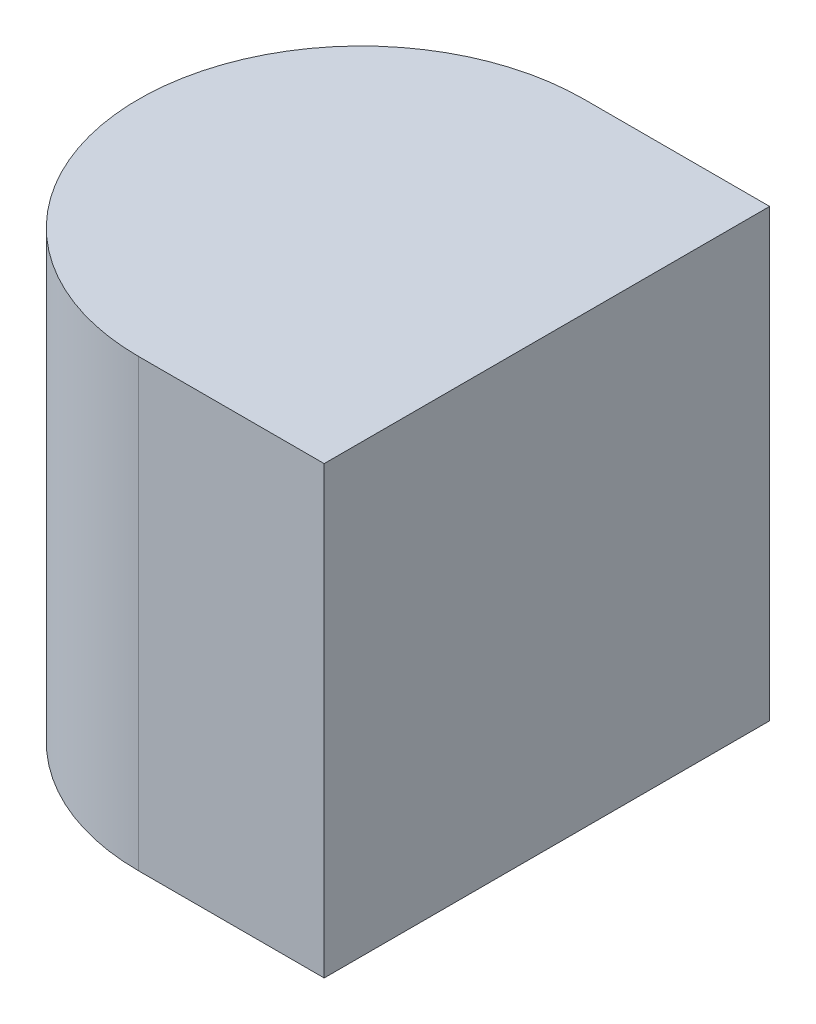
ISO-10303-21;
HEADER;
FILE_DESCRIPTION(('STEP AP214'),'2;1');
FILE_NAME('part.step','',(''),(''),'','','');
FILE_SCHEMA(('AUTOMOTIVE_DESIGN { 1 0 10303 214 1 1 1 1 }'));
ENDSEC;
DATA;
#1=APPLICATION_CONTEXT('core data for automotive mechanical design processes');
#2=APPLICATION_PROTOCOL_DEFINITION('international standard','automotive_design',2000,#1);
#3=PRODUCT_CONTEXT('',#1,'mechanical');
#4=PRODUCT('Part','Part','',(#3));
#5=PRODUCT_RELATED_PRODUCT_CATEGORY('part','',(#4));
#6=PRODUCT_DEFINITION_FORMATION('','',#4);
#7=PRODUCT_DEFINITION_CONTEXT('part definition',#1,'design');
#8=PRODUCT_DEFINITION('design','',#6,#7);
#9=PRODUCT_DEFINITION_SHAPE('','',#8);
#10=(LENGTH_UNIT() NAMED_UNIT(*) SI_UNIT(.MILLI.,.METRE.));
#11=(NAMED_UNIT(*) PLANE_ANGLE_UNIT() SI_UNIT($,.RADIAN.));
#12=(NAMED_UNIT(*) SI_UNIT($,.STERADIAN.) SOLID_ANGLE_UNIT());
#13=UNCERTAINTY_MEASURE_WITH_UNIT(LENGTH_MEASURE(1.E-05),#10,'distance_accuracy_value','');
#14=(GEOMETRIC_REPRESENTATION_CONTEXT(3) GLOBAL_UNCERTAINTY_ASSIGNED_CONTEXT((#13)) GLOBAL_UNIT_ASSIGNED_CONTEXT((#10,
#11,#12)) REPRESENTATION_CONTEXT('',''));
#15=CARTESIAN_POINT('',(0.,0.,0.));
#16=DIRECTION('',(0.,0.,1.));
#17=DIRECTION('',(1.,0.,0.));
#18=AXIS2_PLACEMENT_3D('',#15,#16,#17);
#19=CARTESIAN_POINT('',(-118.270219320132,-255.599072168842,-908.24864798632));
#20=DIRECTION('',(1.,0.,0.));
#21=DIRECTION('',(0.,1.,0.));
#22=AXIS2_PLACEMENT_3D('',#19,#20,#21);
#23=PLANE('',#22);
#24=DIRECTION('',(0.,0.,-1.));
#25=VECTOR('',#24,1.);
#26=CARTESIAN_POINT('',(-118.270219320132,-255.599072168842,-907.486147986319));
#27=LINE('',#26,#25);
#28=CARTESIAN_POINT('',(-118.270219320132,-255.599072168842,-908.39864798632));
#29=VERTEX_POINT('',#28);
#30=CARTESIAN_POINT('',(-118.270219320132,-255.599072168842,-908.24864798632));
#31=VERTEX_POINT('',#30);
#32=EDGE_CURVE('E53',#29,#31,#27,.F.);
#33=ORIENTED_EDGE('',*,*,#32,.T.);
#34=DIRECTION('',(0.,-1.,0.));
#35=VECTOR('',#34,1.);
#36=CARTESIAN_POINT('',(-118.270219320132,-255.599072168842,-908.24864798632));
#37=LINE('',#36,#35);
#38=CARTESIAN_POINT('',(-118.270219320132,-255.749072168844,-908.24864798632));
#39=VERTEX_POINT('',#38);
#40=EDGE_CURVE('E73',#39,#31,#37,.F.);
#41=ORIENTED_EDGE('',*,*,#40,.F.);
#42=DIRECTION('',(0.,0.,-1.));
#43=VECTOR('',#42,1.);
#44=CARTESIAN_POINT('',(-118.270219320132,-255.749072168844,-908.222757346923));
#45=LINE('',#44,#43);
#46=CARTESIAN_POINT('',(-118.270219320132,-255.749072168844,-908.39864798632));
#47=VERTEX_POINT('',#46);
#48=EDGE_CURVE('E62',#47,#39,#45,.F.);
#49=ORIENTED_EDGE('',*,*,#48,.F.);
#50=DIRECTION('',(0.,1.,0.));
#51=VECTOR('',#50,1.);
#52=CARTESIAN_POINT('',(-118.270219320132,-255.599072168842,-908.39864798632));
#53=LINE('',#52,#51);
#54=EDGE_CURVE('E93',#29,#47,#53,.F.);
#55=ORIENTED_EDGE('',*,*,#54,.F.);
#56=EDGE_LOOP('',(#33,#41,#49,#55));
#57=FACE_BOUND('',#56,.T.);
#58=ADVANCED_FACE('F17',(#57),#23,.T.);
#59=CARTESIAN_POINT('',(-118.321373910134,-255.749072168844,-908.222757346923));
#60=DIRECTION('',(0.,-1.,0.));
#61=DIRECTION('',(0.,0.,-1.));
#62=AXIS2_PLACEMENT_3D('',#59,#60,#61);
#63=PLANE('',#62);
#64=CARTESIAN_POINT('',(-118.332719320132,-255.749072168844,-908.32364798632));
#65=DIRECTION('',(0.,-1.,0.));
#66=DIRECTION('',(0.,0.,-1.));
#67=AXIS2_PLACEMENT_3D('',#64,#65,#66);
#68=CIRCLE('',#67,0.075);
#69=CARTESIAN_POINT('',(-118.332719320132,-255.749072168844,-908.39864798632));
#70=VERTEX_POINT('',#69);
#71=CARTESIAN_POINT('',(-118.332719320132,-255.749072168844,-908.24864798632));
#72=VERTEX_POINT('',#71);
#73=EDGE_CURVE('E20',#70,#72,#68,.F.);
#74=ORIENTED_EDGE('',*,*,#73,.F.);
#75=DIRECTION('',(1.,0.,0.));
#76=VECTOR('',#75,1.);
#77=CARTESIAN_POINT('',(-118.270219320132,-255.749072168844,-908.39864798632));
#78=LINE('',#77,#76);
#79=EDGE_CURVE('E68',#47,#70,#78,.F.);
#80=ORIENTED_EDGE('',*,*,#79,.F.);
#81=ORIENTED_EDGE('',*,*,#48,.T.);
#82=DIRECTION('',(1.,0.,0.));
#83=VECTOR('',#82,1.);
#84=CARTESIAN_POINT('',(-118.332719320132,-255.749072168844,-908.24864798632));
#85=LINE('',#84,#83);
#86=EDGE_CURVE('E66',#72,#39,#85,.T.);
#87=ORIENTED_EDGE('',*,*,#86,.F.);
#88=EDGE_LOOP('',(#74,#80,#81,#87));
#89=FACE_BOUND('',#88,.T.);
#90=ADVANCED_FACE('F64',(#89),#63,.T.);
#91=CARTESIAN_POINT('',(-118.332719320132,-255.599072168842,-908.24864798632));
#92=DIRECTION('',(0.,0.,1.));
#93=DIRECTION('',(0.,-1.,0.));
#94=AXIS2_PLACEMENT_3D('',#91,#92,#93);
#95=PLANE('',#94);
#96=DIRECTION('',(1.,0.,0.));
#97=VECTOR('',#96,1.);
#98=CARTESIAN_POINT('',(-114.682719320133,-255.599072168842,-908.24864798632));
#99=LINE('',#98,#97);
#100=CARTESIAN_POINT('',(-118.332719320132,-255.599072168842,-908.24864798632));
#101=VERTEX_POINT('',#100);
#102=EDGE_CURVE('E76',#31,#101,#99,.F.);
#103=ORIENTED_EDGE('',*,*,#102,.T.);
#104=DIRECTION('',(0.,-1.,0.));
#105=VECTOR('',#104,1.);
#106=CARTESIAN_POINT('',(-118.332719320132,-255.599072168842,-908.24864798632));
#107=LINE('',#106,#105);
#108=EDGE_CURVE('E80',#72,#101,#107,.F.);
#109=ORIENTED_EDGE('',*,*,#108,.F.);
#110=ORIENTED_EDGE('',*,*,#86,.T.);
#111=ORIENTED_EDGE('',*,*,#40,.T.);
#112=EDGE_LOOP('',(#103,#109,#110,#111));
#113=FACE_BOUND('',#112,.T.);
#114=ADVANCED_FACE('F78',(#113),#95,.T.);
#115=CARTESIAN_POINT('',(-114.682719320133,-255.599072168842,-907.486147986319));
#116=DIRECTION('',(0.,-1.,0.));
#117=DIRECTION('',(0.,0.,-1.));
#118=AXIS2_PLACEMENT_3D('',#115,#116,#117);
#119=PLANE('',#118);
#120=DIRECTION('',(1.,0.,0.));
#121=VECTOR('',#120,1.);
#122=CARTESIAN_POINT('',(-118.270219320132,-255.599072168842,-908.39864798632));
#123=LINE('',#122,#121);
#124=CARTESIAN_POINT('',(-118.332719320132,-255.599072168842,-908.39864798632));
#125=VERTEX_POINT('',#124);
#126=EDGE_CURVE('E36',#125,#29,#123,.T.);
#127=ORIENTED_EDGE('',*,*,#126,.F.);
#128=CARTESIAN_POINT('',(-118.332719320132,-255.599072168842,-908.32364798632));
#129=DIRECTION('',(0.,-1.,0.));
#130=DIRECTION('',(0.,0.,-1.));
#131=AXIS2_PLACEMENT_3D('',#128,#129,#130);
#132=CIRCLE('',#131,0.075);
#133=EDGE_CURVE('E27',#101,#125,#132,.T.);
#134=ORIENTED_EDGE('',*,*,#133,.F.);
#135=ORIENTED_EDGE('',*,*,#102,.F.);
#136=ORIENTED_EDGE('',*,*,#32,.F.);
#137=EDGE_LOOP('',(#127,#134,#135,#136));
#138=FACE_BOUND('',#137,.T.);
#139=ADVANCED_FACE('F120',(#138),#119,.F.);
#140=CARTESIAN_POINT('',(-118.270219320132,-255.599072168842,-908.39864798632));
#141=DIRECTION('',(0.,0.,-1.));
#142=DIRECTION('',(0.,1.,0.));
#143=AXIS2_PLACEMENT_3D('',#140,#141,#142);
#144=PLANE('',#143);
#145=ORIENTED_EDGE('',*,*,#126,.T.);
#146=ORIENTED_EDGE('',*,*,#54,.T.);
#147=ORIENTED_EDGE('',*,*,#79,.T.);
#148=DIRECTION('',(0.,1.,0.));
#149=VECTOR('',#148,1.);
#150=CARTESIAN_POINT('',(-118.332719320132,-255.599072168842,-908.39864798632));
#151=LINE('',#150,#149);
#152=EDGE_CURVE('E11',#125,#70,#151,.F.);
#153=ORIENTED_EDGE('',*,*,#152,.F.);
#154=EDGE_LOOP('',(#145,#146,#147,#153));
#155=FACE_BOUND('',#154,.T.);
#156=ADVANCED_FACE('F109',(#155),#144,.T.);
#157=CARTESIAN_POINT('',(-118.332719320132,-255.599072168842,-908.32364798632));
#158=DIRECTION('',(0.,-1.,0.));
#159=DIRECTION('',(0.,0.,-1.));
#160=AXIS2_PLACEMENT_3D('',#157,#158,#159);
#161=CYLINDRICAL_SURFACE('',#160,0.075);
#162=ORIENTED_EDGE('',*,*,#133,.T.);
#163=ORIENTED_EDGE('',*,*,#152,.T.);
#164=ORIENTED_EDGE('',*,*,#73,.T.);
#165=ORIENTED_EDGE('',*,*,#108,.T.);
#166=EDGE_LOOP('',(#162,#163,#164,#165));
#167=FACE_BOUND('',#166,.T.);
#168=ADVANCED_FACE('F107',(#167),#161,.T.);
#169=CLOSED_SHELL('',(#58,#90,#114,#139,#156,#168));
#170=MANIFOLD_SOLID_BREP('B1',#169);
#171=ADVANCED_BREP_SHAPE_REPRESENTATION('',(#18,#170),#14);
#172=SHAPE_DEFINITION_REPRESENTATION(#9,#171);
ENDSEC;
END-ISO-10303-21;
